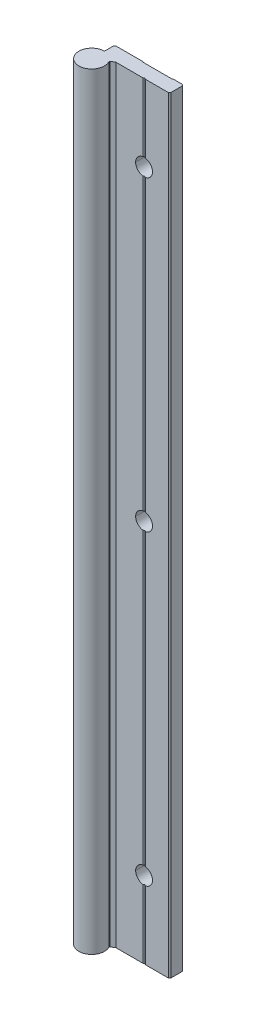
ISO-10303-21;
HEADER;
FILE_DESCRIPTION(('STEP AP214'),'2;1');
FILE_NAME('part.step','',(''),(''),'','','');
FILE_SCHEMA(('AUTOMOTIVE_DESIGN { 1 0 10303 214 1 1 1 1 }'));
ENDSEC;
DATA;
#1=APPLICATION_CONTEXT('core data for automotive mechanical design processes');
#2=APPLICATION_PROTOCOL_DEFINITION('international standard','automotive_design',2000,#1);
#3=PRODUCT_CONTEXT('',#1,'mechanical');
#4=PRODUCT('Part','Part','',(#3));
#5=PRODUCT_RELATED_PRODUCT_CATEGORY('part','',(#4));
#6=PRODUCT_DEFINITION_FORMATION('','',#4);
#7=PRODUCT_DEFINITION_CONTEXT('part definition',#1,'design');
#8=PRODUCT_DEFINITION('design','',#6,#7);
#9=PRODUCT_DEFINITION_SHAPE('','',#8);
#10=(LENGTH_UNIT() NAMED_UNIT(*) SI_UNIT(.MILLI.,.METRE.));
#11=(NAMED_UNIT(*) PLANE_ANGLE_UNIT() SI_UNIT($,.RADIAN.));
#12=(NAMED_UNIT(*) SI_UNIT($,.STERADIAN.) SOLID_ANGLE_UNIT());
#13=UNCERTAINTY_MEASURE_WITH_UNIT(LENGTH_MEASURE(1.E-05),#10,'distance_accuracy_value','');
#14=(GEOMETRIC_REPRESENTATION_CONTEXT(3) GLOBAL_UNCERTAINTY_ASSIGNED_CONTEXT((#13)) GLOBAL_UNIT_ASSIGNED_CONTEXT((#10,
#11,#12)) REPRESENTATION_CONTEXT('',''));
#15=CARTESIAN_POINT('',(0.,0.,0.));
#16=DIRECTION('',(0.,0.,1.));
#17=DIRECTION('',(1.,0.,0.));
#18=AXIS2_PLACEMENT_3D('',#15,#16,#17);
#19=CARTESIAN_POINT('',(-27.,0.,9.));
#20=DIRECTION('',(0.,1.,0.));
#21=DIRECTION('',(0.890278934786818,0.,-0.45541565440249));
#22=AXIS2_PLACEMENT_3D('',#19,#20,#21);
#23=CYLINDRICAL_SURFACE('',#22,4.99999999558106);
#24=DIRECTION('',(0.,-1.,0.));
#25=VECTOR('',#24,1.);
#26=CARTESIAN_POINT('',(-31.45139467,0.,11.27707827));
#27=LINE('',#26,#25);
#28=CARTESIAN_POINT('',(-31.45139467,300.,11.27707827));
#29=VERTEX_POINT('',#28);
#30=CARTESIAN_POINT('',(-31.45139467,0.,11.27707827));
#31=VERTEX_POINT('',#30);
#32=EDGE_CURVE('E40',#29,#31,#27,.T.);
#33=ORIENTED_EDGE('',*,*,#32,.F.);
#34=CARTESIAN_POINT('',(-27.,300.,9.));
#35=DIRECTION('',(0.,-1.,0.));
#36=DIRECTION('',(0.890278934786818,0.,-0.45541565440249));
#37=AXIS2_PLACEMENT_3D('',#34,#35,#36);
#38=CIRCLE('',#37,4.99999999558106);
#39=CARTESIAN_POINT('',(-27.28301887007,300.,4.00801639876543));
#40=VERTEX_POINT('',#39);
#41=EDGE_CURVE('E11',#29,#40,#38,.T.);
#42=ORIENTED_EDGE('',*,*,#41,.T.);
#43=DIRECTION('',(0.,1.,0.));
#44=VECTOR('',#43,1.);
#45=CARTESIAN_POINT('',(-27.28301887007,0.,4.00801639876543));
#46=LINE('',#45,#44);
#47=CARTESIAN_POINT('',(-27.28301887007,0.,4.00801639876543));
#48=VERTEX_POINT('',#47);
#49=EDGE_CURVE('E386',#48,#40,#46,.T.);
#50=ORIENTED_EDGE('',*,*,#49,.F.);
#51=CARTESIAN_POINT('',(-27.,0.,9.));
#52=DIRECTION('',(0.,-1.,0.));
#53=DIRECTION('',(0.890278934786818,0.,-0.45541565440249));
#54=AXIS2_PLACEMENT_3D('',#51,#52,#53);
#55=CIRCLE('',#54,4.99999999558106);
#56=EDGE_CURVE('E359',#31,#48,#55,.T.);
#57=ORIENTED_EDGE('',*,*,#56,.F.);
#58=EDGE_LOOP('',(#33,#42,#50,#57));
#59=FACE_BOUND('',#58,.T.);
#60=ADVANCED_FACE('F16',(#59),#23,.T.);
#61=CARTESIAN_POINT('',(-10.,30.,2.85));
#62=DIRECTION('',(0.,0.,1.));
#63=DIRECTION('',(1.,0.,0.));
#64=AXIS2_PLACEMENT_3D('',#61,#62,#63);
#65=CYLINDRICAL_SURFACE('',#64,3.3);
#66=DIRECTION('',(0.,0.,-1.));
#67=VECTOR('',#66,1.);
#68=CARTESIAN_POINT('',(-6.7,30.,2.85));
#69=LINE('',#68,#67);
#70=CARTESIAN_POINT('',(-6.7,30.,5.5));
#71=VERTEX_POINT('',#70);
#72=CARTESIAN_POINT('',(-6.7,30.,0.2));
#73=VERTEX_POINT('',#72);
#74=EDGE_CURVE('E579',#71,#73,#69,.T.);
#75=ORIENTED_EDGE('',*,*,#74,.F.);
#76=CARTESIAN_POINT('',(-10.,30.,5.5));
#77=DIRECTION('',(0.,0.,-1.));
#78=DIRECTION('',(1.,0.,0.));
#79=AXIS2_PLACEMENT_3D('',#76,#77,#78);
#80=CIRCLE('',#79,3.3);
#81=CARTESIAN_POINT('',(-9.5,33.26190128606,5.5));
#82=VERTEX_POINT('',#81);
#83=EDGE_CURVE('E472',#82,#71,#80,.T.);
#84=ORIENTED_EDGE('',*,*,#83,.F.);
#85=CARTESIAN_POINT('',(-10.,30.,5.21132487));
#86=DIRECTION('',(0.499999994031162,0.,-0.866025407230549));
#87=DIRECTION('',(0.866025407230549,0.,0.499999994031162));
#88=AXIS2_PLACEMENT_3D('',#85,#86,#87);
#89=ELLIPSE('',#88,3.81051176148865,3.3);
#90=CARTESIAN_POINT('',(-10.,33.3,5.21132487));
#91=VERTEX_POINT('',#90);
#92=EDGE_CURVE('E414',#91,#82,#89,.T.);
#93=ORIENTED_EDGE('',*,*,#92,.F.);
#94=CARTESIAN_POINT('',(-10.,30.,5.21132487));
#95=DIRECTION('',(-0.499999994031162,0.,-0.866025407230549));
#96=DIRECTION('',(0.866025407230549,0.,-0.499999994031162));
#97=AXIS2_PLACEMENT_3D('',#94,#95,#96);
#98=ELLIPSE('',#97,3.81051176148865,3.3);
#99=CARTESIAN_POINT('',(-10.5,33.26190128606,5.5));
#100=VERTEX_POINT('',#99);
#101=EDGE_CURVE('E578',#100,#91,#98,.T.);
#102=ORIENTED_EDGE('',*,*,#101,.F.);
#103=CARTESIAN_POINT('',(-10.,30.,5.5));
#104=DIRECTION('',(0.,0.,-1.));
#105=DIRECTION('',(1.,0.,0.));
#106=AXIS2_PLACEMENT_3D('',#103,#104,#105);
#107=CIRCLE('',#106,3.3);
#108=CARTESIAN_POINT('',(-13.3,30.,5.5));
#109=VERTEX_POINT('',#108);
#110=EDGE_CURVE('E333',#109,#100,#107,.T.);
#111=ORIENTED_EDGE('',*,*,#110,.F.);
#112=DIRECTION('',(0.,0.,1.));
#113=VECTOR('',#112,1.);
#114=CARTESIAN_POINT('',(-13.3,30.,2.85));
#115=LINE('',#114,#113);
#116=CARTESIAN_POINT('',(-13.3,30.,0.2));
#117=VERTEX_POINT('',#116);
#118=EDGE_CURVE('E330',#117,#109,#115,.T.);
#119=ORIENTED_EDGE('',*,*,#118,.F.);
#120=CARTESIAN_POINT('',(-10.,30.,0.2));
#121=DIRECTION('',(0.,0.,1.));
#122=DIRECTION('',(1.,0.,0.));
#123=AXIS2_PLACEMENT_3D('',#120,#121,#122);
#124=CIRCLE('',#123,3.3);
#125=EDGE_CURVE('E496',#73,#117,#124,.T.);
#126=ORIENTED_EDGE('',*,*,#125,.F.);
#127=EDGE_LOOP('',(#75,#84,#93,#102,#111,#119,#126));
#128=FACE_BOUND('',#127,.T.);
#129=ADVANCED_FACE('F714',(#128),#65,.F.);
#130=CARTESIAN_POINT('',(-10.,150.,2.85));
#131=DIRECTION('',(0.,0.,1.));
#132=DIRECTION('',(1.,0.,0.));
#133=AXIS2_PLACEMENT_3D('',#130,#131,#132);
#134=CYLINDRICAL_SURFACE('',#133,3.3);
#135=DIRECTION('',(0.,0.,-1.));
#136=VECTOR('',#135,1.);
#137=CARTESIAN_POINT('',(-6.7,150.,2.85));
#138=LINE('',#137,#136);
#139=CARTESIAN_POINT('',(-6.7,150.,5.5));
#140=VERTEX_POINT('',#139);
#141=CARTESIAN_POINT('',(-6.7,150.,0.2));
#142=VERTEX_POINT('',#141);
#143=EDGE_CURVE('E398',#140,#142,#138,.T.);
#144=ORIENTED_EDGE('',*,*,#143,.F.);
#145=CARTESIAN_POINT('',(-10.,150.,5.5));
#146=DIRECTION('',(0.,0.,-1.));
#147=DIRECTION('',(1.,0.,0.));
#148=AXIS2_PLACEMENT_3D('',#145,#146,#147);
#149=CIRCLE('',#148,3.3);
#150=CARTESIAN_POINT('',(-9.5,153.26190128606,5.5));
#151=VERTEX_POINT('',#150);
#152=EDGE_CURVE('E392',#151,#140,#149,.T.);
#153=ORIENTED_EDGE('',*,*,#152,.F.);
#154=CARTESIAN_POINT('',(-10.,150.,5.21132487));
#155=DIRECTION('',(0.499999994031162,0.,-0.866025407230549));
#156=DIRECTION('',(0.866025407230549,0.,0.499999994031162));
#157=AXIS2_PLACEMENT_3D('',#154,#155,#156);
#158=ELLIPSE('',#157,3.81051176148865,3.3);
#159=CARTESIAN_POINT('',(-10.,153.3,5.21132487));
#160=VERTEX_POINT('',#159);
#161=EDGE_CURVE('E424',#160,#151,#158,.T.);
#162=ORIENTED_EDGE('',*,*,#161,.F.);
#163=CARTESIAN_POINT('',(-10.,150.,5.21132487));
#164=DIRECTION('',(-0.499999994031162,0.,-0.866025407230549));
#165=DIRECTION('',(0.866025407230549,0.,-0.499999994031162));
#166=AXIS2_PLACEMENT_3D('',#163,#164,#165);
#167=ELLIPSE('',#166,3.81051176148865,3.3);
#168=CARTESIAN_POINT('',(-10.5,153.26190128606,5.5));
#169=VERTEX_POINT('',#168);
#170=EDGE_CURVE('E397',#169,#160,#167,.T.);
#171=ORIENTED_EDGE('',*,*,#170,.F.);
#172=CARTESIAN_POINT('',(-10.,150.,5.5));
#173=DIRECTION('',(0.,0.,-1.));
#174=DIRECTION('',(1.,0.,0.));
#175=AXIS2_PLACEMENT_3D('',#172,#173,#174);
#176=CIRCLE('',#175,3.3);
#177=CARTESIAN_POINT('',(-13.3,150.,5.5));
#178=VERTEX_POINT('',#177);
#179=EDGE_CURVE('E360',#178,#169,#176,.T.);
#180=ORIENTED_EDGE('',*,*,#179,.F.);
#181=DIRECTION('',(0.,0.,1.));
#182=VECTOR('',#181,1.);
#183=CARTESIAN_POINT('',(-13.3,150.,2.85));
#184=LINE('',#183,#182);
#185=CARTESIAN_POINT('',(-13.3,150.,0.2));
#186=VERTEX_POINT('',#185);
#187=EDGE_CURVE('E438',#186,#178,#184,.T.);
#188=ORIENTED_EDGE('',*,*,#187,.F.);
#189=CARTESIAN_POINT('',(-10.,150.,0.2));
#190=DIRECTION('',(0.,0.,1.));
#191=DIRECTION('',(1.,0.,0.));
#192=AXIS2_PLACEMENT_3D('',#189,#190,#191);
#193=CIRCLE('',#192,3.3);
#194=EDGE_CURVE('E497',#142,#186,#193,.T.);
#195=ORIENTED_EDGE('',*,*,#194,.F.);
#196=EDGE_LOOP('',(#144,#153,#162,#171,#180,#188,#195));
#197=FACE_BOUND('',#196,.T.);
#198=ADVANCED_FACE('F741',(#197),#134,.F.);
#199=CARTESIAN_POINT('',(-10.,270.,2.85));
#200=DIRECTION('',(0.,0.,1.));
#201=DIRECTION('',(1.,0.,0.));
#202=AXIS2_PLACEMENT_3D('',#199,#200,#201);
#203=CYLINDRICAL_SURFACE('',#202,3.3);
#204=DIRECTION('',(0.,0.,-1.));
#205=VECTOR('',#204,1.);
#206=CARTESIAN_POINT('',(-6.7,270.,2.85));
#207=LINE('',#206,#205);
#208=CARTESIAN_POINT('',(-6.7,270.,5.5));
#209=VERTEX_POINT('',#208);
#210=CARTESIAN_POINT('',(-6.7,270.,0.2));
#211=VERTEX_POINT('',#210);
#212=EDGE_CURVE('E27',#209,#211,#207,.T.);
#213=ORIENTED_EDGE('',*,*,#212,.F.);
#214=CARTESIAN_POINT('',(-10.,270.,5.5));
#215=DIRECTION('',(0.,0.,-1.));
#216=DIRECTION('',(1.,0.,0.));
#217=AXIS2_PLACEMENT_3D('',#214,#215,#216);
#218=CIRCLE('',#217,3.3);
#219=CARTESIAN_POINT('',(-9.5,273.26190128606,5.5));
#220=VERTEX_POINT('',#219);
#221=EDGE_CURVE('E391',#220,#209,#218,.T.);
#222=ORIENTED_EDGE('',*,*,#221,.F.);
#223=CARTESIAN_POINT('',(-10.,270.,5.21132487));
#224=DIRECTION('',(0.499999994031162,0.,-0.866025407230549));
#225=DIRECTION('',(0.866025407230549,0.,0.499999994031162));
#226=AXIS2_PLACEMENT_3D('',#223,#224,#225);
#227=ELLIPSE('',#226,3.81051176148865,3.3);
#228=CARTESIAN_POINT('',(-10.,273.3,5.21132487));
#229=VERTEX_POINT('',#228);
#230=EDGE_CURVE('E375',#229,#220,#227,.T.);
#231=ORIENTED_EDGE('',*,*,#230,.F.);
#232=CARTESIAN_POINT('',(-10.,270.,5.21132487));
#233=DIRECTION('',(-0.499999994031162,0.,-0.866025407230549));
#234=DIRECTION('',(0.866025407230549,0.,-0.499999994031162));
#235=AXIS2_PLACEMENT_3D('',#232,#233,#234);
#236=ELLIPSE('',#235,3.81051176148865,3.3);
#237=CARTESIAN_POINT('',(-10.5,273.26190128606,5.5));
#238=VERTEX_POINT('',#237);
#239=EDGE_CURVE('E532',#238,#229,#236,.T.);
#240=ORIENTED_EDGE('',*,*,#239,.F.);
#241=CARTESIAN_POINT('',(-10.,270.,5.5));
#242=DIRECTION('',(0.,0.,-1.));
#243=DIRECTION('',(1.,0.,0.));
#244=AXIS2_PLACEMENT_3D('',#241,#242,#243);
#245=CIRCLE('',#244,3.3);
#246=CARTESIAN_POINT('',(-13.3,270.,5.5));
#247=VERTEX_POINT('',#246);
#248=EDGE_CURVE('E355',#247,#238,#245,.T.);
#249=ORIENTED_EDGE('',*,*,#248,.F.);
#250=DIRECTION('',(0.,0.,1.));
#251=VECTOR('',#250,1.);
#252=CARTESIAN_POINT('',(-13.3,270.,2.85));
#253=LINE('',#252,#251);
#254=CARTESIAN_POINT('',(-13.3,270.,0.2));
#255=VERTEX_POINT('',#254);
#256=EDGE_CURVE('E401',#255,#247,#253,.T.);
#257=ORIENTED_EDGE('',*,*,#256,.F.);
#258=CARTESIAN_POINT('',(-10.,270.,0.2));
#259=DIRECTION('',(0.,0.,1.));
#260=DIRECTION('',(1.,0.,0.));
#261=AXIS2_PLACEMENT_3D('',#258,#259,#260);
#262=CIRCLE('',#261,3.3);
#263=EDGE_CURVE('E630',#211,#255,#262,.T.);
#264=ORIENTED_EDGE('',*,*,#263,.F.);
#265=EDGE_LOOP('',(#213,#222,#231,#240,#249,#257,#264));
#266=FACE_BOUND('',#265,.T.);
#267=ADVANCED_FACE('F781',(#266),#203,.F.);
#268=CARTESIAN_POINT('',(-10.,270.,2.85));
#269=DIRECTION('',(0.,0.,1.));
#270=DIRECTION('',(1.,0.,0.));
#271=AXIS2_PLACEMENT_3D('',#268,#269,#270);
#272=CYLINDRICAL_SURFACE('',#271,3.3);
#273=ORIENTED_EDGE('',*,*,#212,.T.);
#274=CARTESIAN_POINT('',(-10.,270.,0.2));
#275=DIRECTION('',(0.,0.,1.));
#276=DIRECTION('',(1.,0.,0.));
#277=AXIS2_PLACEMENT_3D('',#274,#275,#276);
#278=CIRCLE('',#277,3.3);
#279=EDGE_CURVE('E546',#255,#211,#278,.T.);
#280=ORIENTED_EDGE('',*,*,#279,.F.);
#281=ORIENTED_EDGE('',*,*,#256,.T.);
#282=CARTESIAN_POINT('',(-10.,270.,5.5));
#283=DIRECTION('',(0.,0.,-1.));
#284=DIRECTION('',(1.,0.,0.));
#285=AXIS2_PLACEMENT_3D('',#282,#283,#284);
#286=CIRCLE('',#285,3.3);
#287=CARTESIAN_POINT('',(-10.5,266.73809871394,5.5));
#288=VERTEX_POINT('',#287);
#289=EDGE_CURVE('E569',#288,#247,#286,.T.);
#290=ORIENTED_EDGE('',*,*,#289,.F.);
#291=CARTESIAN_POINT('',(-10.,270.,5.21132487));
#292=DIRECTION('',(-0.499999994031162,0.,-0.866025407230549));
#293=DIRECTION('',(0.866025407230549,0.,-0.499999994031162));
#294=AXIS2_PLACEMENT_3D('',#291,#292,#293);
#295=ELLIPSE('',#294,3.81051176148865,3.3);
#296=CARTESIAN_POINT('',(-10.,266.7,5.21132487));
#297=VERTEX_POINT('',#296);
#298=EDGE_CURVE('E516',#297,#288,#295,.T.);
#299=ORIENTED_EDGE('',*,*,#298,.F.);
#300=CARTESIAN_POINT('',(-10.,270.,5.21132487));
#301=DIRECTION('',(0.499999994031162,0.,-0.866025407230549));
#302=DIRECTION('',(0.866025407230549,0.,0.499999994031162));
#303=AXIS2_PLACEMENT_3D('',#300,#301,#302);
#304=ELLIPSE('',#303,3.81051176148865,3.3);
#305=CARTESIAN_POINT('',(-9.5,266.73809871394,5.5));
#306=VERTEX_POINT('',#305);
#307=EDGE_CURVE('E420',#306,#297,#304,.T.);
#308=ORIENTED_EDGE('',*,*,#307,.F.);
#309=CARTESIAN_POINT('',(-10.,270.,5.5));
#310=DIRECTION('',(0.,0.,-1.));
#311=DIRECTION('',(1.,0.,0.));
#312=AXIS2_PLACEMENT_3D('',#309,#310,#311);
#313=CIRCLE('',#312,3.3);
#314=EDGE_CURVE('E387',#209,#306,#313,.T.);
#315=ORIENTED_EDGE('',*,*,#314,.F.);
#316=EDGE_LOOP('',(#273,#280,#281,#290,#299,#308,#315));
#317=FACE_BOUND('',#316,.T.);
#318=ADVANCED_FACE('F776',(#317),#272,.F.);
#319=CARTESIAN_POINT('',(-5.,0.,5.5));
#320=DIRECTION('',(0.,0.,1.));
#321=DIRECTION('',(1.,0.,0.));
#322=AXIS2_PLACEMENT_3D('',#319,#320,#321);
#323=PLANE('',#322);
#324=ORIENTED_EDGE('',*,*,#221,.T.);
#325=ORIENTED_EDGE('',*,*,#314,.T.);
#326=DIRECTION('',(0.,1.,0.));
#327=VECTOR('',#326,1.);
#328=CARTESIAN_POINT('',(-9.5,0.,5.5));
#329=LINE('',#328,#327);
#330=EDGE_CURVE('E601',#151,#306,#329,.T.);
#331=ORIENTED_EDGE('',*,*,#330,.F.);
#332=ORIENTED_EDGE('',*,*,#152,.T.);
#333=CARTESIAN_POINT('',(-10.,150.,5.5));
#334=DIRECTION('',(0.,0.,-1.));
#335=DIRECTION('',(1.,0.,0.));
#336=AXIS2_PLACEMENT_3D('',#333,#334,#335);
#337=CIRCLE('',#336,3.3);
#338=CARTESIAN_POINT('',(-9.5,146.73809871394,5.5));
#339=VERTEX_POINT('',#338);
#340=EDGE_CURVE('E476',#140,#339,#337,.T.);
#341=ORIENTED_EDGE('',*,*,#340,.T.);
#342=DIRECTION('',(0.,1.,0.));
#343=VECTOR('',#342,1.);
#344=CARTESIAN_POINT('',(-9.5,0.,5.5));
#345=LINE('',#344,#343);
#346=EDGE_CURVE('E410',#82,#339,#345,.T.);
#347=ORIENTED_EDGE('',*,*,#346,.F.);
#348=ORIENTED_EDGE('',*,*,#83,.T.);
#349=CARTESIAN_POINT('',(-10.,30.,5.5));
#350=DIRECTION('',(0.,0.,-1.));
#351=DIRECTION('',(1.,0.,0.));
#352=AXIS2_PLACEMENT_3D('',#349,#350,#351);
#353=CIRCLE('',#352,3.3);
#354=CARTESIAN_POINT('',(-9.5,26.73809871394,5.5));
#355=VERTEX_POINT('',#354);
#356=EDGE_CURVE('E380',#71,#355,#353,.T.);
#357=ORIENTED_EDGE('',*,*,#356,.T.);
#358=DIRECTION('',(0.,1.,0.));
#359=VECTOR('',#358,1.);
#360=CARTESIAN_POINT('',(-9.5,0.,5.5));
#361=LINE('',#360,#359);
#362=CARTESIAN_POINT('',(-9.5,0.,5.5));
#363=VERTEX_POINT('',#362);
#364=EDGE_CURVE('E321',#363,#355,#361,.T.);
#365=ORIENTED_EDGE('',*,*,#364,.F.);
#366=DIRECTION('',(-1.,0.,0.));
#367=VECTOR('',#366,1.);
#368=CARTESIAN_POINT('',(-0.5,0.,5.5));
#369=LINE('',#368,#367);
#370=CARTESIAN_POINT('',(-0.5,0.,5.5));
#371=VERTEX_POINT('',#370);
#372=EDGE_CURVE('E483',#371,#363,#369,.T.);
#373=ORIENTED_EDGE('',*,*,#372,.F.);
#374=DIRECTION('',(0.,1.,0.));
#375=VECTOR('',#374,1.);
#376=CARTESIAN_POINT('',(-0.5,0.,5.5));
#377=LINE('',#376,#375);
#378=CARTESIAN_POINT('',(-0.5,300.,5.5));
#379=VERTEX_POINT('',#378);
#380=EDGE_CURVE('E376',#371,#379,#377,.T.);
#381=ORIENTED_EDGE('',*,*,#380,.T.);
#382=DIRECTION('',(-1.,0.,0.));
#383=VECTOR('',#382,1.);
#384=CARTESIAN_POINT('',(-0.5,300.,5.5));
#385=LINE('',#384,#383);
#386=CARTESIAN_POINT('',(-9.5,300.,5.5));
#387=VERTEX_POINT('',#386);
#388=EDGE_CURVE('E20',#379,#387,#385,.T.);
#389=ORIENTED_EDGE('',*,*,#388,.T.);
#390=DIRECTION('',(0.,1.,0.));
#391=VECTOR('',#390,1.);
#392=CARTESIAN_POINT('',(-9.5,0.,5.5));
#393=LINE('',#392,#391);
#394=EDGE_CURVE('E65',#220,#387,#393,.T.);
#395=ORIENTED_EDGE('',*,*,#394,.F.);
#396=EDGE_LOOP('',(#324,#325,#331,#332,#341,#347,#348,#357,#365,#373,#381,#389,#395));
#397=FACE_BOUND('',#396,.T.);
#398=ADVANCED_FACE('F710',(#397),#323,.T.);
#399=CARTESIAN_POINT('',(-9.75,0.,5.355662435));
#400=DIRECTION('',(-0.499999994031163,0.,0.866025407230548));
#401=DIRECTION('',(0.,1.,0.));
#402=AXIS2_PLACEMENT_3D('',#399,#400,#401);
#403=PLANE('',#402);
#404=ORIENTED_EDGE('',*,*,#307,.T.);
#405=DIRECTION('',(0.,1.,0.));
#406=VECTOR('',#405,1.);
#407=CARTESIAN_POINT('',(-10.,0.,5.21132487));
#408=LINE('',#407,#406);
#409=EDGE_CURVE('E393',#160,#297,#408,.T.);
#410=ORIENTED_EDGE('',*,*,#409,.F.);
#411=ORIENTED_EDGE('',*,*,#161,.T.);
#412=ORIENTED_EDGE('',*,*,#330,.T.);
#413=EDGE_LOOP('',(#404,#410,#411,#412));
#414=FACE_BOUND('',#413,.T.);
#415=ADVANCED_FACE('F744',(#414),#403,.T.);
#416=CARTESIAN_POINT('',(-10.25,0.,5.355662435));
#417=DIRECTION('',(0.499999994031163,0.,0.866025407230548));
#418=DIRECTION('',(0.,-1.,0.));
#419=AXIS2_PLACEMENT_3D('',#416,#417,#418);
#420=PLANE('',#419);
#421=ORIENTED_EDGE('',*,*,#298,.T.);
#422=DIRECTION('',(0.,1.,0.));
#423=VECTOR('',#422,1.);
#424=CARTESIAN_POINT('',(-10.5,0.,5.5));
#425=LINE('',#424,#423);
#426=EDGE_CURVE('E363',#169,#288,#425,.T.);
#427=ORIENTED_EDGE('',*,*,#426,.F.);
#428=ORIENTED_EDGE('',*,*,#170,.T.);
#429=ORIENTED_EDGE('',*,*,#409,.T.);
#430=EDGE_LOOP('',(#421,#427,#428,#429));
#431=FACE_BOUND('',#430,.T.);
#432=ADVANCED_FACE('F747',(#431),#420,.T.);
#433=CARTESIAN_POINT('',(-10.,150.,2.85));
#434=DIRECTION('',(0.,0.,1.));
#435=DIRECTION('',(1.,0.,0.));
#436=AXIS2_PLACEMENT_3D('',#433,#434,#435);
#437=CYLINDRICAL_SURFACE('',#436,3.3);
#438=ORIENTED_EDGE('',*,*,#143,.T.);
#439=CARTESIAN_POINT('',(-10.,150.,0.2));
#440=DIRECTION('',(0.,0.,1.));
#441=DIRECTION('',(1.,0.,0.));
#442=AXIS2_PLACEMENT_3D('',#439,#440,#441);
#443=CIRCLE('',#442,3.3);
#444=EDGE_CURVE('E500',#186,#142,#443,.T.);
#445=ORIENTED_EDGE('',*,*,#444,.F.);
#446=ORIENTED_EDGE('',*,*,#187,.T.);
#447=CARTESIAN_POINT('',(-10.,150.,5.5));
#448=DIRECTION('',(0.,0.,-1.));
#449=DIRECTION('',(1.,0.,0.));
#450=AXIS2_PLACEMENT_3D('',#447,#448,#449);
#451=CIRCLE('',#450,3.3);
#452=CARTESIAN_POINT('',(-10.5,146.73809871394,5.5));
#453=VERTEX_POINT('',#452);
#454=EDGE_CURVE('E82',#453,#178,#451,.T.);
#455=ORIENTED_EDGE('',*,*,#454,.F.);
#456=CARTESIAN_POINT('',(-10.,150.,5.21132487));
#457=DIRECTION('',(-0.499999994031162,0.,-0.866025407230549));
#458=DIRECTION('',(0.866025407230549,0.,-0.499999994031162));
#459=AXIS2_PLACEMENT_3D('',#456,#457,#458);
#460=ELLIPSE('',#459,3.81051176148865,3.3);
#461=CARTESIAN_POINT('',(-10.,146.7,5.21132487));
#462=VERTEX_POINT('',#461);
#463=EDGE_CURVE('E415',#462,#453,#460,.T.);
#464=ORIENTED_EDGE('',*,*,#463,.F.);
#465=CARTESIAN_POINT('',(-10.,150.,5.21132487));
#466=DIRECTION('',(0.499999994031162,0.,-0.866025407230549));
#467=DIRECTION('',(0.866025407230549,0.,0.499999994031162));
#468=AXIS2_PLACEMENT_3D('',#465,#466,#467);
#469=ELLIPSE('',#468,3.81051176148865,3.3);
#470=EDGE_CURVE('E434',#339,#462,#469,.T.);
#471=ORIENTED_EDGE('',*,*,#470,.F.);
#472=ORIENTED_EDGE('',*,*,#340,.F.);
#473=EDGE_LOOP('',(#438,#445,#446,#455,#464,#471,#472));
#474=FACE_BOUND('',#473,.T.);
#475=ADVANCED_FACE('F753',(#474),#437,.F.);
#476=CARTESIAN_POINT('',(-9.75,0.,5.355662435));
#477=DIRECTION('',(-0.499999994031163,0.,0.866025407230548));
#478=DIRECTION('',(0.,1.,0.));
#479=AXIS2_PLACEMENT_3D('',#476,#477,#478);
#480=PLANE('',#479);
#481=ORIENTED_EDGE('',*,*,#470,.T.);
#482=DIRECTION('',(0.,1.,0.));
#483=VECTOR('',#482,1.);
#484=CARTESIAN_POINT('',(-10.,0.,5.21132487));
#485=LINE('',#484,#483);
#486=EDGE_CURVE('E574',#91,#462,#485,.T.);
#487=ORIENTED_EDGE('',*,*,#486,.F.);
#488=ORIENTED_EDGE('',*,*,#92,.T.);
#489=ORIENTED_EDGE('',*,*,#346,.T.);
#490=EDGE_LOOP('',(#481,#487,#488,#489));
#491=FACE_BOUND('',#490,.T.);
#492=ADVANCED_FACE('F750',(#491),#480,.T.);
#493=CARTESIAN_POINT('',(-10.25,0.,5.355662435));
#494=DIRECTION('',(0.499999994031163,0.,0.866025407230548));
#495=DIRECTION('',(0.,-1.,0.));
#496=AXIS2_PLACEMENT_3D('',#493,#494,#495);
#497=PLANE('',#496);
#498=ORIENTED_EDGE('',*,*,#463,.T.);
#499=DIRECTION('',(0.,1.,0.));
#500=VECTOR('',#499,1.);
#501=CARTESIAN_POINT('',(-10.5,0.,5.5));
#502=LINE('',#501,#500);
#503=EDGE_CURVE('E479',#100,#453,#502,.T.);
#504=ORIENTED_EDGE('',*,*,#503,.F.);
#505=ORIENTED_EDGE('',*,*,#101,.T.);
#506=ORIENTED_EDGE('',*,*,#486,.T.);
#507=EDGE_LOOP('',(#498,#504,#505,#506));
#508=FACE_BOUND('',#507,.T.);
#509=ADVANCED_FACE('F691',(#508),#497,.T.);
#510=CARTESIAN_POINT('',(-10.,30.,2.85));
#511=DIRECTION('',(0.,0.,1.));
#512=DIRECTION('',(1.,0.,0.));
#513=AXIS2_PLACEMENT_3D('',#510,#511,#512);
#514=CYLINDRICAL_SURFACE('',#513,3.3);
#515=ORIENTED_EDGE('',*,*,#74,.T.);
#516=CARTESIAN_POINT('',(-10.,30.,0.2));
#517=DIRECTION('',(0.,0.,1.));
#518=DIRECTION('',(1.,0.,0.));
#519=AXIS2_PLACEMENT_3D('',#516,#517,#518);
#520=CIRCLE('',#519,3.3);
#521=EDGE_CURVE('E501',#117,#73,#520,.T.);
#522=ORIENTED_EDGE('',*,*,#521,.F.);
#523=ORIENTED_EDGE('',*,*,#118,.T.);
#524=CARTESIAN_POINT('',(-10.,30.,5.5));
#525=DIRECTION('',(0.,0.,-1.));
#526=DIRECTION('',(1.,0.,0.));
#527=AXIS2_PLACEMENT_3D('',#524,#525,#526);
#528=CIRCLE('',#527,3.3);
#529=CARTESIAN_POINT('',(-10.5,26.73809871394,5.5));
#530=VERTEX_POINT('',#529);
#531=EDGE_CURVE('E325',#530,#109,#528,.T.);
#532=ORIENTED_EDGE('',*,*,#531,.F.);
#533=CARTESIAN_POINT('',(-10.,30.,5.21132487));
#534=DIRECTION('',(-0.499999994031162,0.,-0.866025407230549));
#535=DIRECTION('',(0.866025407230549,0.,-0.499999994031162));
#536=AXIS2_PLACEMENT_3D('',#533,#534,#535);
#537=ELLIPSE('',#536,3.81051176148865,3.3);
#538=CARTESIAN_POINT('',(-10.,26.7,5.21132487));
#539=VERTEX_POINT('',#538);
#540=EDGE_CURVE('E308',#539,#530,#537,.T.);
#541=ORIENTED_EDGE('',*,*,#540,.F.);
#542=CARTESIAN_POINT('',(-10.,30.,5.21132487));
#543=DIRECTION('',(0.499999994031162,0.,-0.866025407230549));
#544=DIRECTION('',(0.866025407230549,0.,0.499999994031162));
#545=AXIS2_PLACEMENT_3D('',#542,#543,#544);
#546=ELLIPSE('',#545,3.81051176148865,3.3);
#547=EDGE_CURVE('E448',#355,#539,#546,.T.);
#548=ORIENTED_EDGE('',*,*,#547,.F.);
#549=ORIENTED_EDGE('',*,*,#356,.F.);
#550=EDGE_LOOP('',(#515,#522,#523,#532,#541,#548,#549));
#551=FACE_BOUND('',#550,.T.);
#552=ADVANCED_FACE('F327',(#551),#514,.F.);
#553=CARTESIAN_POINT('',(-15.75,0.,5.5));
#554=DIRECTION('',(0.,0.,1.));
#555=DIRECTION('',(1.,0.,0.));
#556=AXIS2_PLACEMENT_3D('',#553,#554,#555);
#557=PLANE('',#556);
#558=ORIENTED_EDGE('',*,*,#289,.T.);
#559=ORIENTED_EDGE('',*,*,#248,.T.);
#560=DIRECTION('',(0.,1.,0.));
#561=VECTOR('',#560,1.);
#562=CARTESIAN_POINT('',(-10.5,0.,5.5));
#563=LINE('',#562,#561);
#564=CARTESIAN_POINT('',(-10.5,300.,5.5));
#565=VERTEX_POINT('',#564);
#566=EDGE_CURVE('E347',#238,#565,#563,.T.);
#567=ORIENTED_EDGE('',*,*,#566,.T.);
#568=DIRECTION('',(-1.,0.,0.));
#569=VECTOR('',#568,1.);
#570=CARTESIAN_POINT('',(-10.5,300.,5.5));
#571=LINE('',#570,#569);
#572=CARTESIAN_POINT('',(-21.,300.,5.5));
#573=VERTEX_POINT('',#572);
#574=EDGE_CURVE('E340',#565,#573,#571,.T.);
#575=ORIENTED_EDGE('',*,*,#574,.T.);
#576=DIRECTION('',(0.,1.,0.));
#577=VECTOR('',#576,1.);
#578=CARTESIAN_POINT('',(-21.,0.,5.5));
#579=LINE('',#578,#577);
#580=CARTESIAN_POINT('',(-21.,0.,5.5));
#581=VERTEX_POINT('',#580);
#582=EDGE_CURVE('E427',#581,#573,#579,.T.);
#583=ORIENTED_EDGE('',*,*,#582,.F.);
#584=DIRECTION('',(-1.,0.,0.));
#585=VECTOR('',#584,1.);
#586=CARTESIAN_POINT('',(-10.5,0.,5.5));
#587=LINE('',#586,#585);
#588=CARTESIAN_POINT('',(-10.5,0.,5.5));
#589=VERTEX_POINT('',#588);
#590=EDGE_CURVE('E338',#589,#581,#587,.T.);
#591=ORIENTED_EDGE('',*,*,#590,.F.);
#592=DIRECTION('',(0.,1.,0.));
#593=VECTOR('',#592,1.);
#594=CARTESIAN_POINT('',(-10.5,0.,5.5));
#595=LINE('',#594,#593);
#596=EDGE_CURVE('E313',#589,#530,#595,.T.);
#597=ORIENTED_EDGE('',*,*,#596,.T.);
#598=ORIENTED_EDGE('',*,*,#531,.T.);
#599=ORIENTED_EDGE('',*,*,#110,.T.);
#600=ORIENTED_EDGE('',*,*,#503,.T.);
#601=ORIENTED_EDGE('',*,*,#454,.T.);
#602=ORIENTED_EDGE('',*,*,#179,.T.);
#603=ORIENTED_EDGE('',*,*,#426,.T.);
#604=EDGE_LOOP('',(#558,#559,#567,#575,#583,#591,#597,#598,#599,#600,#601,#602,#603));
#605=FACE_BOUND('',#604,.T.);
#606=ADVANCED_FACE('F336',(#605),#557,.T.);
#607=CARTESIAN_POINT('',(-10.25,0.,5.355662435));
#608=DIRECTION('',(0.499999994031163,0.,0.866025407230548));
#609=DIRECTION('',(0.,-1.,0.));
#610=AXIS2_PLACEMENT_3D('',#607,#608,#609);
#611=PLANE('',#610);
#612=ORIENTED_EDGE('',*,*,#239,.T.);
#613=DIRECTION('',(0.,1.,0.));
#614=VECTOR('',#613,1.);
#615=CARTESIAN_POINT('',(-10.,0.,5.21132487));
#616=LINE('',#615,#614);
#617=CARTESIAN_POINT('',(-10.,300.,5.21132487));
#618=VERTEX_POINT('',#617);
#619=EDGE_CURVE('E374',#229,#618,#616,.T.);
#620=ORIENTED_EDGE('',*,*,#619,.T.);
#621=DIRECTION('',(-0.866025407230548,0.,0.499999994031163));
#622=VECTOR('',#621,1.);
#623=CARTESIAN_POINT('',(-10.,300.,5.21132487));
#624=LINE('',#623,#622);
#625=EDGE_CURVE('E370',#618,#565,#624,.T.);
#626=ORIENTED_EDGE('',*,*,#625,.T.);
#627=ORIENTED_EDGE('',*,*,#566,.F.);
#628=EDGE_LOOP('',(#612,#620,#626,#627));
#629=FACE_BOUND('',#628,.T.);
#630=ADVANCED_FACE('F887',(#629),#611,.T.);
#631=CARTESIAN_POINT('',(-9.75,0.,5.355662435));
#632=DIRECTION('',(-0.499999994031163,0.,0.866025407230548));
#633=DIRECTION('',(0.,1.,0.));
#634=AXIS2_PLACEMENT_3D('',#631,#632,#633);
#635=PLANE('',#634);
#636=ORIENTED_EDGE('',*,*,#230,.T.);
#637=ORIENTED_EDGE('',*,*,#394,.T.);
#638=DIRECTION('',(-0.866025407230548,0.,-0.499999994031163));
#639=VECTOR('',#638,1.);
#640=CARTESIAN_POINT('',(-9.5,300.,5.5));
#641=LINE('',#640,#639);
#642=EDGE_CURVE('E560',#387,#618,#641,.T.);
#643=ORIENTED_EDGE('',*,*,#642,.T.);
#644=ORIENTED_EDGE('',*,*,#619,.F.);
#645=EDGE_LOOP('',(#636,#637,#643,#644));
#646=FACE_BOUND('',#645,.T.);
#647=ADVANCED_FACE('F891',(#646),#635,.T.);
#648=CARTESIAN_POINT('',(-21.25,0.,0.));
#649=DIRECTION('',(0.,0.,-1.));
#650=DIRECTION('',(0.,-1.,0.));
#651=AXIS2_PLACEMENT_3D('',#648,#649,#650);
#652=PLANE('',#651);
#653=DIRECTION('',(1.,0.,0.));
#654=VECTOR('',#653,1.);
#655=CARTESIAN_POINT('',(-26.5,300.,0.));
#656=LINE('',#655,#654);
#657=CARTESIAN_POINT('',(-26.5,300.,0.));
#658=VERTEX_POINT('',#657);
#659=CARTESIAN_POINT('',(-16.,300.,0.));
#660=VERTEX_POINT('',#659);
#661=EDGE_CURVE('E405',#658,#660,#656,.T.);
#662=ORIENTED_EDGE('',*,*,#661,.T.);
#663=DIRECTION('',(0.,1.,0.));
#664=VECTOR('',#663,1.);
#665=CARTESIAN_POINT('',(-16.,0.,0.));
#666=LINE('',#665,#664);
#667=CARTESIAN_POINT('',(-16.,0.,0.));
#668=VERTEX_POINT('',#667);
#669=EDGE_CURVE('E505',#668,#660,#666,.T.);
#670=ORIENTED_EDGE('',*,*,#669,.F.);
#671=DIRECTION('',(1.,0.,0.));
#672=VECTOR('',#671,1.);
#673=CARTESIAN_POINT('',(-26.5,0.,0.));
#674=LINE('',#673,#672);
#675=CARTESIAN_POINT('',(-26.5,0.,0.));
#676=VERTEX_POINT('',#675);
#677=EDGE_CURVE('E369',#676,#668,#674,.T.);
#678=ORIENTED_EDGE('',*,*,#677,.F.);
#679=DIRECTION('',(0.,1.,0.));
#680=VECTOR('',#679,1.);
#681=CARTESIAN_POINT('',(-26.5,0.,0.));
#682=LINE('',#681,#680);
#683=EDGE_CURVE('E402',#676,#658,#682,.T.);
#684=ORIENTED_EDGE('',*,*,#683,.T.);
#685=EDGE_LOOP('',(#662,#670,#678,#684));
#686=FACE_BOUND('',#685,.T.);
#687=ADVANCED_FACE('F730',(#686),#652,.T.);
#688=CARTESIAN_POINT('',(-15.9,0.,0.1));
#689=DIRECTION('',(0.707106781186549,0.,-0.707106781186546));
#690=DIRECTION('',(0.,-1.,0.));
#691=AXIS2_PLACEMENT_3D('',#688,#689,#690);
#692=PLANE('',#691);
#693=DIRECTION('',(0.707106781186546,0.,0.707106781186549));
#694=VECTOR('',#693,1.);
#695=CARTESIAN_POINT('',(-16.,300.,0.));
#696=LINE('',#695,#694);
#697=CARTESIAN_POINT('',(-15.8,300.,0.2));
#698=VERTEX_POINT('',#697);
#699=EDGE_CURVE('E406',#660,#698,#696,.T.);
#700=ORIENTED_EDGE('',*,*,#699,.T.);
#701=DIRECTION('',(0.,1.,0.));
#702=VECTOR('',#701,1.);
#703=CARTESIAN_POINT('',(-15.8,0.,0.2));
#704=LINE('',#703,#702);
#705=CARTESIAN_POINT('',(-15.8,0.,0.2));
#706=VERTEX_POINT('',#705);
#707=EDGE_CURVE('E528',#706,#698,#704,.T.);
#708=ORIENTED_EDGE('',*,*,#707,.F.);
#709=DIRECTION('',(0.707106781186546,0.,0.707106781186549));
#710=VECTOR('',#709,1.);
#711=CARTESIAN_POINT('',(-16.,0.,0.));
#712=LINE('',#711,#710);
#713=EDGE_CURVE('E535',#668,#706,#712,.T.);
#714=ORIENTED_EDGE('',*,*,#713,.F.);
#715=ORIENTED_EDGE('',*,*,#669,.T.);
#716=EDGE_LOOP('',(#700,#708,#714,#715));
#717=FACE_BOUND('',#716,.T.);
#718=ADVANCED_FACE('F719',(#717),#692,.T.);
#719=CARTESIAN_POINT('',(-10.,0.,0.2));
#720=DIRECTION('',(0.,0.,-1.));
#721=DIRECTION('',(0.,-1.,0.));
#722=AXIS2_PLACEMENT_3D('',#719,#720,#721);
#723=PLANE('',#722);
#724=DIRECTION('',(1.,0.,0.));
#725=VECTOR('',#724,1.);
#726=CARTESIAN_POINT('',(-15.8,300.,0.2));
#727=LINE('',#726,#725);
#728=CARTESIAN_POINT('',(-4.2,300.,0.2));
#729=VERTEX_POINT('',#728);
#730=EDGE_CURVE('E522',#698,#729,#727,.T.);
#731=ORIENTED_EDGE('',*,*,#730,.T.);
#732=DIRECTION('',(0.,1.,0.));
#733=VECTOR('',#732,1.);
#734=CARTESIAN_POINT('',(-4.2,0.,0.2));
#735=LINE('',#734,#733);
#736=CARTESIAN_POINT('',(-4.2,0.,0.2));
#737=VERTEX_POINT('',#736);
#738=EDGE_CURVE('E429',#737,#729,#735,.T.);
#739=ORIENTED_EDGE('',*,*,#738,.F.);
#740=DIRECTION('',(1.,0.,0.));
#741=VECTOR('',#740,1.);
#742=CARTESIAN_POINT('',(-15.8,0.,0.2));
#743=LINE('',#742,#741);
#744=EDGE_CURVE('E552',#706,#737,#743,.T.);
#745=ORIENTED_EDGE('',*,*,#744,.F.);
#746=ORIENTED_EDGE('',*,*,#707,.T.);
#747=EDGE_LOOP('',(#731,#739,#745,#746));
#748=FACE_BOUND('',#747,.T.);
#749=ORIENTED_EDGE('',*,*,#279,.T.);
#750=ORIENTED_EDGE('',*,*,#263,.T.);
#751=EDGE_LOOP('',(#749,#750));
#752=FACE_BOUND('',#751,.T.);
#753=ORIENTED_EDGE('',*,*,#444,.T.);
#754=ORIENTED_EDGE('',*,*,#194,.T.);
#755=EDGE_LOOP('',(#753,#754));
#756=FACE_BOUND('',#755,.T.);
#757=ORIENTED_EDGE('',*,*,#521,.T.);
#758=ORIENTED_EDGE('',*,*,#125,.T.);
#759=EDGE_LOOP('',(#757,#758));
#760=FACE_BOUND('',#759,.T.);
#761=ADVANCED_FACE('F716',(#748,#752,#756,#760),#723,.T.);
#762=CARTESIAN_POINT('',(-4.1,0.,0.1));
#763=DIRECTION('',(-0.707106781186547,0.,-0.707106781186548));
#764=DIRECTION('',(-0.707106781186548,0.,0.707106781186547));
#765=AXIS2_PLACEMENT_3D('',#762,#763,#764);
#766=PLANE('',#765);
#767=DIRECTION('',(0.707106781186548,0.,-0.707106781186547));
#768=VECTOR('',#767,1.);
#769=CARTESIAN_POINT('',(-4.2,300.,0.2));
#770=LINE('',#769,#768);
#771=CARTESIAN_POINT('',(-4.,300.,0.));
#772=VERTEX_POINT('',#771);
#773=EDGE_CURVE('E432',#729,#772,#770,.T.);
#774=ORIENTED_EDGE('',*,*,#773,.T.);
#775=DIRECTION('',(0.,1.,0.));
#776=VECTOR('',#775,1.);
#777=CARTESIAN_POINT('',(-4.,0.,0.));
#778=LINE('',#777,#776);
#779=CARTESIAN_POINT('',(-4.,0.,0.));
#780=VERTEX_POINT('',#779);
#781=EDGE_CURVE('E660',#780,#772,#778,.T.);
#782=ORIENTED_EDGE('',*,*,#781,.F.);
#783=DIRECTION('',(0.707106781186548,0.,-0.707106781186547));
#784=VECTOR('',#783,1.);
#785=CARTESIAN_POINT('',(-4.2,0.,0.2));
#786=LINE('',#785,#784);
#787=EDGE_CURVE('E470',#737,#780,#786,.T.);
#788=ORIENTED_EDGE('',*,*,#787,.F.);
#789=ORIENTED_EDGE('',*,*,#738,.T.);
#790=EDGE_LOOP('',(#774,#782,#788,#789));
#791=FACE_BOUND('',#790,.T.);
#792=ADVANCED_FACE('F718',(#791),#766,.T.);
#793=CARTESIAN_POINT('',(-2.25,0.,0.));
#794=DIRECTION('',(0.,0.,-1.));
#795=DIRECTION('',(0.,-1.,0.));
#796=AXIS2_PLACEMENT_3D('',#793,#794,#795);
#797=PLANE('',#796);
#798=DIRECTION('',(1.,0.,0.));
#799=VECTOR('',#798,1.);
#800=CARTESIAN_POINT('',(-4.,300.,0.));
#801=LINE('',#800,#799);
#802=CARTESIAN_POINT('',(-0.5,300.,0.));
#803=VERTEX_POINT('',#802);
#804=EDGE_CURVE('E433',#772,#803,#801,.T.);
#805=ORIENTED_EDGE('',*,*,#804,.T.);
#806=DIRECTION('',(0.,1.,0.));
#807=VECTOR('',#806,1.);
#808=CARTESIAN_POINT('',(-0.5,0.,0.));
#809=LINE('',#808,#807);
#810=CARTESIAN_POINT('',(-0.5,0.,0.));
#811=VERTEX_POINT('',#810);
#812=EDGE_CURVE('E460',#811,#803,#809,.T.);
#813=ORIENTED_EDGE('',*,*,#812,.F.);
#814=DIRECTION('',(1.,0.,0.));
#815=VECTOR('',#814,1.);
#816=CARTESIAN_POINT('',(-4.,0.,0.));
#817=LINE('',#816,#815);
#818=EDGE_CURVE('E467',#780,#811,#817,.T.);
#819=ORIENTED_EDGE('',*,*,#818,.F.);
#820=ORIENTED_EDGE('',*,*,#781,.T.);
#821=EDGE_LOOP('',(#805,#813,#819,#820));
#822=FACE_BOUND('',#821,.T.);
#823=ADVANCED_FACE('F727',(#822),#797,.T.);
#824=CARTESIAN_POINT('',(-0.25,0.,0.25));
#825=DIRECTION('',(0.707106781186548,0.,-0.707106781186548));
#826=DIRECTION('',(0.,-1.,0.));
#827=AXIS2_PLACEMENT_3D('',#824,#825,#826);
#828=PLANE('',#827);
#829=DIRECTION('',(0.707106781186548,0.,0.707106781186548));
#830=VECTOR('',#829,1.);
#831=CARTESIAN_POINT('',(-0.5,300.,0.));
#832=LINE('',#831,#830);
#833=CARTESIAN_POINT('',(0.,300.,0.5));
#834=VERTEX_POINT('',#833);
#835=EDGE_CURVE('E351',#803,#834,#832,.T.);
#836=ORIENTED_EDGE('',*,*,#835,.T.);
#837=DIRECTION('',(0.,1.,0.));
#838=VECTOR('',#837,1.);
#839=CARTESIAN_POINT('',(0.,0.,0.5));
#840=LINE('',#839,#838);
#841=CARTESIAN_POINT('',(0.,0.,0.5));
#842=VERTEX_POINT('',#841);
#843=EDGE_CURVE('E461',#842,#834,#840,.T.);
#844=ORIENTED_EDGE('',*,*,#843,.F.);
#845=DIRECTION('',(0.707106781186548,0.,0.707106781186548));
#846=VECTOR('',#845,1.);
#847=CARTESIAN_POINT('',(-0.5,0.,0.));
#848=LINE('',#847,#846);
#849=EDGE_CURVE('E471',#811,#842,#848,.T.);
#850=ORIENTED_EDGE('',*,*,#849,.F.);
#851=ORIENTED_EDGE('',*,*,#812,.T.);
#852=EDGE_LOOP('',(#836,#844,#850,#851));
#853=FACE_BOUND('',#852,.T.);
#854=ADVANCED_FACE('F811',(#853),#828,.T.);
#855=CARTESIAN_POINT('',(0.,0.,2.75));
#856=DIRECTION('',(1.,0.,0.));
#857=DIRECTION('',(0.,1.,0.));
#858=AXIS2_PLACEMENT_3D('',#855,#856,#857);
#859=PLANE('',#858);
#860=DIRECTION('',(0.,0.,1.));
#861=VECTOR('',#860,1.);
#862=CARTESIAN_POINT('',(0.,300.,0.5));
#863=LINE('',#862,#861);
#864=CARTESIAN_POINT('',(0.,300.,5.));
#865=VERTEX_POINT('',#864);
#866=EDGE_CURVE('E456',#834,#865,#863,.T.);
#867=ORIENTED_EDGE('',*,*,#866,.T.);
#868=DIRECTION('',(0.,1.,0.));
#869=VECTOR('',#868,1.);
#870=CARTESIAN_POINT('',(0.,0.,5.));
#871=LINE('',#870,#869);
#872=CARTESIAN_POINT('',(0.,0.,5.));
#873=VERTEX_POINT('',#872);
#874=EDGE_CURVE('E443',#873,#865,#871,.T.);
#875=ORIENTED_EDGE('',*,*,#874,.F.);
#876=DIRECTION('',(0.,0.,1.));
#877=VECTOR('',#876,1.);
#878=CARTESIAN_POINT('',(0.,0.,0.5));
#879=LINE('',#878,#877);
#880=EDGE_CURVE('E563',#842,#873,#879,.T.);
#881=ORIENTED_EDGE('',*,*,#880,.F.);
#882=ORIENTED_EDGE('',*,*,#843,.T.);
#883=EDGE_LOOP('',(#867,#875,#881,#882));
#884=FACE_BOUND('',#883,.T.);
#885=ADVANCED_FACE('F845',(#884),#859,.T.);
#886=CARTESIAN_POINT('',(-0.25,0.,5.25));
#887=DIRECTION('',(0.707106781186548,0.,0.707106781186548));
#888=DIRECTION('',(0.,-1.,0.));
#889=AXIS2_PLACEMENT_3D('',#886,#887,#888);
#890=PLANE('',#889);
#891=DIRECTION('',(-0.707106781186548,0.,0.707106781186548));
#892=VECTOR('',#891,1.);
#893=CARTESIAN_POINT('',(0.,300.,5.));
#894=LINE('',#893,#892);
#895=EDGE_CURVE('E447',#865,#379,#894,.T.);
#896=ORIENTED_EDGE('',*,*,#895,.T.);
#897=ORIENTED_EDGE('',*,*,#380,.F.);
#898=DIRECTION('',(-0.707106781186548,0.,0.707106781186548));
#899=VECTOR('',#898,1.);
#900=CARTESIAN_POINT('',(0.,0.,5.));
#901=LINE('',#900,#899);
#902=EDGE_CURVE('E486',#873,#371,#901,.T.);
#903=ORIENTED_EDGE('',*,*,#902,.F.);
#904=ORIENTED_EDGE('',*,*,#874,.T.);
#905=EDGE_LOOP('',(#896,#897,#903,#904));
#906=FACE_BOUND('',#905,.T.);
#907=ADVANCED_FACE('F906',(#906),#890,.T.);
#908=CARTESIAN_POINT('',(-9.75,0.,5.355662435));
#909=DIRECTION('',(-0.499999994031163,0.,0.866025407230548));
#910=DIRECTION('',(0.,1.,0.));
#911=AXIS2_PLACEMENT_3D('',#908,#909,#910);
#912=PLANE('',#911);
#913=ORIENTED_EDGE('',*,*,#547,.T.);
#914=DIRECTION('',(0.,1.,0.));
#915=VECTOR('',#914,1.);
#916=CARTESIAN_POINT('',(-10.,0.,5.21132487));
#917=LINE('',#916,#915);
#918=CARTESIAN_POINT('',(-10.,0.,5.21132487));
#919=VERTEX_POINT('',#918);
#920=EDGE_CURVE('E316',#919,#539,#917,.T.);
#921=ORIENTED_EDGE('',*,*,#920,.F.);
#922=DIRECTION('',(-0.866025407230548,0.,-0.499999994031163));
#923=VECTOR('',#922,1.);
#924=CARTESIAN_POINT('',(-9.5,0.,5.5));
#925=LINE('',#924,#923);
#926=EDGE_CURVE('E487',#363,#919,#925,.T.);
#927=ORIENTED_EDGE('',*,*,#926,.F.);
#928=ORIENTED_EDGE('',*,*,#364,.T.);
#929=EDGE_LOOP('',(#913,#921,#927,#928));
#930=FACE_BOUND('',#929,.T.);
#931=ADVANCED_FACE('F707',(#930),#912,.T.);
#932=CARTESIAN_POINT('',(-10.25,0.,5.355662435));
#933=DIRECTION('',(0.499999994031163,0.,0.866025407230548));
#934=DIRECTION('',(0.,-1.,0.));
#935=AXIS2_PLACEMENT_3D('',#932,#933,#934);
#936=PLANE('',#935);
#937=ORIENTED_EDGE('',*,*,#540,.T.);
#938=ORIENTED_EDGE('',*,*,#596,.F.);
#939=DIRECTION('',(-0.866025407230548,0.,0.499999994031163));
#940=VECTOR('',#939,1.);
#941=CARTESIAN_POINT('',(-10.,0.,5.21132487));
#942=LINE('',#941,#940);
#943=EDGE_CURVE('E553',#919,#589,#942,.T.);
#944=ORIENTED_EDGE('',*,*,#943,.F.);
#945=ORIENTED_EDGE('',*,*,#920,.T.);
#946=EDGE_LOOP('',(#937,#938,#944,#945));
#947=FACE_BOUND('',#946,.T.);
#948=ADVANCED_FACE('F310',(#947),#936,.T.);
#949=CARTESIAN_POINT('',(-21.715760825,0.,5.913244705));
#950=DIRECTION('',(0.500000000009856,0.,0.866025403778748));
#951=DIRECTION('',(0.,-1.,0.));
#952=AXIS2_PLACEMENT_3D('',#949,#950,#951);
#953=PLANE('',#952);
#954=DIRECTION('',(-0.866025403778748,0.,0.500000000009856));
#955=VECTOR('',#954,1.);
#956=CARTESIAN_POINT('',(-21.,300.,5.5));
#957=LINE('',#956,#955);
#958=CARTESIAN_POINT('',(-22.43152165,300.,6.32648941));
#959=VERTEX_POINT('',#958);
#960=EDGE_CURVE('E409',#573,#959,#957,.T.);
#961=ORIENTED_EDGE('',*,*,#960,.T.);
#962=DIRECTION('',(0.,1.,0.));
#963=VECTOR('',#962,1.);
#964=CARTESIAN_POINT('',(-22.43152165,0.,6.32648941));
#965=LINE('',#964,#963);
#966=CARTESIAN_POINT('',(-22.43152165,0.,6.32648941));
#967=VERTEX_POINT('',#966);
#968=EDGE_CURVE('E416',#967,#959,#965,.T.);
#969=ORIENTED_EDGE('',*,*,#968,.F.);
#970=DIRECTION('',(-0.866025403778748,0.,0.500000000009856));
#971=VECTOR('',#970,1.);
#972=CARTESIAN_POINT('',(-21.,0.,5.5));
#973=LINE('',#972,#971);
#974=EDGE_CURVE('E510',#581,#967,#973,.T.);
#975=ORIENTED_EDGE('',*,*,#974,.F.);
#976=ORIENTED_EDGE('',*,*,#582,.T.);
#977=EDGE_LOOP('',(#961,#969,#975,#976));
#978=FACE_BOUND('',#977,.T.);
#979=ADVANCED_FACE('F881',(#978),#953,.T.);
#980=CARTESIAN_POINT('',(-22.28152165,0.,6.58629703));
#981=DIRECTION('',(0.,1.,0.));
#982=DIRECTION('',(-0.89027892951289,0.,0.455415664712341));
#983=AXIS2_PLACEMENT_3D('',#980,#981,#982);
#984=CYLINDRICAL_SURFACE('',#983,0.299999999016775);
#985=CARTESIAN_POINT('',(-22.28152165,300.,6.58629703));
#986=DIRECTION('',(0.,1.,0.));
#987=DIRECTION('',(-0.89027892951289,0.,0.455415664712341));
#988=AXIS2_PLACEMENT_3D('',#985,#986,#987);
#989=CIRCLE('',#988,0.299999999016775);
#990=CARTESIAN_POINT('',(-22.5486053279785,300.,6.72292172896593));
#991=VERTEX_POINT('',#990);
#992=EDGE_CURVE('E442',#959,#991,#989,.T.);
#993=ORIENTED_EDGE('',*,*,#992,.T.);
#994=DIRECTION('',(0.,1.,0.));
#995=VECTOR('',#994,1.);
#996=CARTESIAN_POINT('',(-22.5486053279785,0.,6.72292172896593));
#997=LINE('',#996,#995);
#998=CARTESIAN_POINT('',(-22.5486053279785,0.,6.72292172896593));
#999=VERTEX_POINT('',#998);
#1000=EDGE_CURVE('E455',#999,#991,#997,.T.);
#1001=ORIENTED_EDGE('',*,*,#1000,.F.);
#1002=CARTESIAN_POINT('',(-22.28152165,0.,6.58629703));
#1003=DIRECTION('',(0.,-1.,0.));
#1004=DIRECTION('',(-0.89027892951289,0.,0.455415664712341));
#1005=AXIS2_PLACEMENT_3D('',#1002,#1003,#1004);
#1006=CIRCLE('',#1005,0.299999999016775);
#1007=EDGE_CURVE('E419',#999,#967,#1006,.T.);
#1008=ORIENTED_EDGE('',*,*,#1007,.T.);
#1009=ORIENTED_EDGE('',*,*,#968,.T.);
#1010=EDGE_LOOP('',(#993,#1001,#1008,#1009));
#1011=FACE_BOUND('',#1010,.T.);
#1012=ADVANCED_FACE('F877',(#1011),#984,.F.);
#1013=CARTESIAN_POINT('',(-27.,0.,9.));
#1014=DIRECTION('',(0.,1.,0.));
#1015=DIRECTION('',(0.890278934786818,0.,-0.45541565440249));
#1016=AXIS2_PLACEMENT_3D('',#1013,#1014,#1015);
#1017=CYLINDRICAL_SURFACE('',#1016,4.99999999558106);
#1018=ORIENTED_EDGE('',*,*,#32,.T.);
#1019=CARTESIAN_POINT('',(-27.,0.,9.));
#1020=DIRECTION('',(0.,-1.,0.));
#1021=DIRECTION('',(0.890278934786818,0.,-0.45541565440249));
#1022=AXIS2_PLACEMENT_3D('',#1019,#1020,#1021);
#1023=CIRCLE('',#1022,4.99999999558106);
#1024=EDGE_CURVE('E506',#999,#31,#1023,.T.);
#1025=ORIENTED_EDGE('',*,*,#1024,.F.);
#1026=ORIENTED_EDGE('',*,*,#1000,.T.);
#1027=CARTESIAN_POINT('',(-27.,300.,9.));
#1028=DIRECTION('',(0.,-1.,0.));
#1029=DIRECTION('',(0.890278934786818,0.,-0.45541565440249));
#1030=AXIS2_PLACEMENT_3D('',#1027,#1028,#1029);
#1031=CIRCLE('',#1030,4.99999999558106);
#1032=EDGE_CURVE('E541',#991,#29,#1031,.T.);
#1033=ORIENTED_EDGE('',*,*,#1032,.T.);
#1034=EDGE_LOOP('',(#1018,#1025,#1026,#1033));
#1035=FACE_BOUND('',#1034,.T.);
#1036=ADVANCED_FACE('F821',(#1035),#1017,.T.);
#1037=CARTESIAN_POINT('',(-27.3,0.,3.70849737999999));
#1038=DIRECTION('',(0.,1.,0.));
#1039=DIRECTION('',(1.,0.,0.));
#1040=AXIS2_PLACEMENT_3D('',#1037,#1038,#1039);
#1041=CYLINDRICAL_SURFACE('',#1040,0.300000003529735);
#1042=CARTESIAN_POINT('',(-27.3,300.,3.70849737999999));
#1043=DIRECTION('',(0.,1.,0.));
#1044=DIRECTION('',(1.,0.,0.));
#1045=AXIS2_PLACEMENT_3D('',#1042,#1043,#1044);
#1046=CIRCLE('',#1045,0.300000003529735);
#1047=CARTESIAN_POINT('',(-26.9999999964703,300.,3.70849738));
#1048=VERTEX_POINT('',#1047);
#1049=EDGE_CURVE('E385',#40,#1048,#1046,.T.);
#1050=ORIENTED_EDGE('',*,*,#1049,.T.);
#1051=DIRECTION('',(0.,1.,0.));
#1052=VECTOR('',#1051,1.);
#1053=CARTESIAN_POINT('',(-26.9999999964703,0.,3.70849738));
#1054=LINE('',#1053,#1052);
#1055=CARTESIAN_POINT('',(-26.9999999964703,0.,3.70849738));
#1056=VERTEX_POINT('',#1055);
#1057=EDGE_CURVE('E462',#1056,#1048,#1054,.T.);
#1058=ORIENTED_EDGE('',*,*,#1057,.F.);
#1059=CARTESIAN_POINT('',(-27.3,0.,3.70849737999999));
#1060=DIRECTION('',(0.,-1.,0.));
#1061=DIRECTION('',(1.,0.,0.));
#1062=AXIS2_PLACEMENT_3D('',#1059,#1060,#1061);
#1063=CIRCLE('',#1062,0.300000003529735);
#1064=EDGE_CURVE('E381',#1056,#48,#1063,.T.);
#1065=ORIENTED_EDGE('',*,*,#1064,.T.);
#1066=ORIENTED_EDGE('',*,*,#49,.T.);
#1067=EDGE_LOOP('',(#1050,#1058,#1065,#1066));
#1068=FACE_BOUND('',#1067,.T.);
#1069=ADVANCED_FACE('F816',(#1068),#1041,.F.);
#1070=CARTESIAN_POINT('',(-27.,0.,2.10424869));
#1071=DIRECTION('',(-1.,0.,0.));
#1072=DIRECTION('',(0.,0.,1.));
#1073=AXIS2_PLACEMENT_3D('',#1070,#1071,#1072);
#1074=PLANE('',#1073);
#1075=DIRECTION('',(0.,0.,-1.));
#1076=VECTOR('',#1075,1.);
#1077=CARTESIAN_POINT('',(-27.,300.,3.70849738));
#1078=LINE('',#1077,#1076);
#1079=CARTESIAN_POINT('',(-27.,300.,0.5));
#1080=VERTEX_POINT('',#1079);
#1081=EDGE_CURVE('E465',#1048,#1080,#1078,.T.);
#1082=ORIENTED_EDGE('',*,*,#1081,.T.);
#1083=DIRECTION('',(0.,1.,0.));
#1084=VECTOR('',#1083,1.);
#1085=CARTESIAN_POINT('',(-27.,0.,0.5));
#1086=LINE('',#1085,#1084);
#1087=CARTESIAN_POINT('',(-27.,0.,0.5));
#1088=VERTEX_POINT('',#1087);
#1089=EDGE_CURVE('E368',#1088,#1080,#1086,.T.);
#1090=ORIENTED_EDGE('',*,*,#1089,.F.);
#1091=DIRECTION('',(0.,0.,-1.));
#1092=VECTOR('',#1091,1.);
#1093=CARTESIAN_POINT('',(-27.,0.,3.70849738));
#1094=LINE('',#1093,#1092);
#1095=EDGE_CURVE('E356',#1056,#1088,#1094,.T.);
#1096=ORIENTED_EDGE('',*,*,#1095,.F.);
#1097=ORIENTED_EDGE('',*,*,#1057,.T.);
#1098=EDGE_LOOP('',(#1082,#1090,#1096,#1097));
#1099=FACE_BOUND('',#1098,.T.);
#1100=ADVANCED_FACE('F820',(#1099),#1074,.T.);
#1101=CARTESIAN_POINT('',(-26.75,0.,0.25));
#1102=DIRECTION('',(-0.707106781186548,0.,-0.707106781186548));
#1103=DIRECTION('',(-0.707106781186548,0.,0.707106781186548));
#1104=AXIS2_PLACEMENT_3D('',#1101,#1102,#1103);
#1105=PLANE('',#1104);
#1106=DIRECTION('',(0.707106781186548,0.,-0.707106781186548));
#1107=VECTOR('',#1106,1.);
#1108=CARTESIAN_POINT('',(-27.,300.,0.5));
#1109=LINE('',#1108,#1107);
#1110=EDGE_CURVE('E466',#1080,#658,#1109,.T.);
#1111=ORIENTED_EDGE('',*,*,#1110,.T.);
#1112=ORIENTED_EDGE('',*,*,#683,.F.);
#1113=DIRECTION('',(0.707106781186548,0.,-0.707106781186548));
#1114=VECTOR('',#1113,1.);
#1115=CARTESIAN_POINT('',(-27.,0.,0.5));
#1116=LINE('',#1115,#1114);
#1117=EDGE_CURVE('E364',#1088,#676,#1116,.T.);
#1118=ORIENTED_EDGE('',*,*,#1117,.F.);
#1119=ORIENTED_EDGE('',*,*,#1089,.T.);
#1120=EDGE_LOOP('',(#1111,#1112,#1118,#1119));
#1121=FACE_BOUND('',#1120,.T.);
#1122=ADVANCED_FACE('F802',(#1121),#1105,.T.);
#1123=CARTESIAN_POINT('',(-16.9525562372127,300.,4.67701417530819));
#1124=DIRECTION('',(0.,-1.,0.));
#1125=DIRECTION('',(0.,0.,-1.));
#1126=AXIS2_PLACEMENT_3D('',#1123,#1124,#1125);
#1127=PLANE('',#1126);
#1128=ORIENTED_EDGE('',*,*,#661,.F.);
#1129=ORIENTED_EDGE('',*,*,#1110,.F.);
#1130=ORIENTED_EDGE('',*,*,#1081,.F.);
#1131=ORIENTED_EDGE('',*,*,#1049,.F.);
#1132=ORIENTED_EDGE('',*,*,#41,.F.);
#1133=ORIENTED_EDGE('',*,*,#1032,.F.);
#1134=ORIENTED_EDGE('',*,*,#992,.F.);
#1135=ORIENTED_EDGE('',*,*,#960,.F.);
#1136=ORIENTED_EDGE('',*,*,#574,.F.);
#1137=ORIENTED_EDGE('',*,*,#625,.F.);
#1138=ORIENTED_EDGE('',*,*,#642,.F.);
#1139=ORIENTED_EDGE('',*,*,#388,.F.);
#1140=ORIENTED_EDGE('',*,*,#895,.F.);
#1141=ORIENTED_EDGE('',*,*,#866,.F.);
#1142=ORIENTED_EDGE('',*,*,#835,.F.);
#1143=ORIENTED_EDGE('',*,*,#804,.F.);
#1144=ORIENTED_EDGE('',*,*,#773,.F.);
#1145=ORIENTED_EDGE('',*,*,#730,.F.);
#1146=ORIENTED_EDGE('',*,*,#699,.F.);
#1147=EDGE_LOOP('',(#1128,#1129,#1130,#1131,#1132,#1133,#1134,#1135,#1136,#1137,#1138,#1139,
#1140,#1141,#1142,#1143,#1144,#1145,#1146));
#1148=FACE_BOUND('',#1147,.T.);
#1149=ADVANCED_FACE('F18',(#1148),#1127,.F.);
#1150=CARTESIAN_POINT('',(-16.9525562372127,0.,4.67701417530819));
#1151=DIRECTION('',(0.,-1.,0.));
#1152=DIRECTION('',(0.,0.,-1.));
#1153=AXIS2_PLACEMENT_3D('',#1150,#1151,#1152);
#1154=PLANE('',#1153);
#1155=ORIENTED_EDGE('',*,*,#1117,.T.);
#1156=ORIENTED_EDGE('',*,*,#677,.T.);
#1157=ORIENTED_EDGE('',*,*,#713,.T.);
#1158=ORIENTED_EDGE('',*,*,#744,.T.);
#1159=ORIENTED_EDGE('',*,*,#787,.T.);
#1160=ORIENTED_EDGE('',*,*,#818,.T.);
#1161=ORIENTED_EDGE('',*,*,#849,.T.);
#1162=ORIENTED_EDGE('',*,*,#880,.T.);
#1163=ORIENTED_EDGE('',*,*,#902,.T.);
#1164=ORIENTED_EDGE('',*,*,#372,.T.);
#1165=ORIENTED_EDGE('',*,*,#926,.T.);
#1166=ORIENTED_EDGE('',*,*,#943,.T.);
#1167=ORIENTED_EDGE('',*,*,#590,.T.);
#1168=ORIENTED_EDGE('',*,*,#974,.T.);
#1169=ORIENTED_EDGE('',*,*,#1007,.F.);
#1170=ORIENTED_EDGE('',*,*,#1024,.T.);
#1171=ORIENTED_EDGE('',*,*,#56,.T.);
#1172=ORIENTED_EDGE('',*,*,#1064,.F.);
#1173=ORIENTED_EDGE('',*,*,#1095,.T.);
#1174=EDGE_LOOP('',(#1155,#1156,#1157,#1158,#1159,#1160,#1161,#1162,#1163,#1164,#1165,#1166,
#1167,#1168,#1169,#1170,#1171,#1172,#1173));
#1175=FACE_BOUND('',#1174,.T.);
#1176=ADVANCED_FACE('F704',(#1175),#1154,.T.);
#1177=CLOSED_SHELL('',(#60,#129,#198,#267,#318,#398,#415,#432,#475,#492,#509,#552,#606,#630,
#647,#687,#718,#761,#792,#823,#854,#885,#907,#931,#948,#979,#1012,#1036,#1069,#1100,#1122,#1149,#1176));
#1178=MANIFOLD_SOLID_BREP('B1',#1177);
#1179=ADVANCED_BREP_SHAPE_REPRESENTATION('',(#18,#1178),#14);
#1180=SHAPE_DEFINITION_REPRESENTATION(#9,#1179);
ENDSEC;
END-ISO-10303-21;
